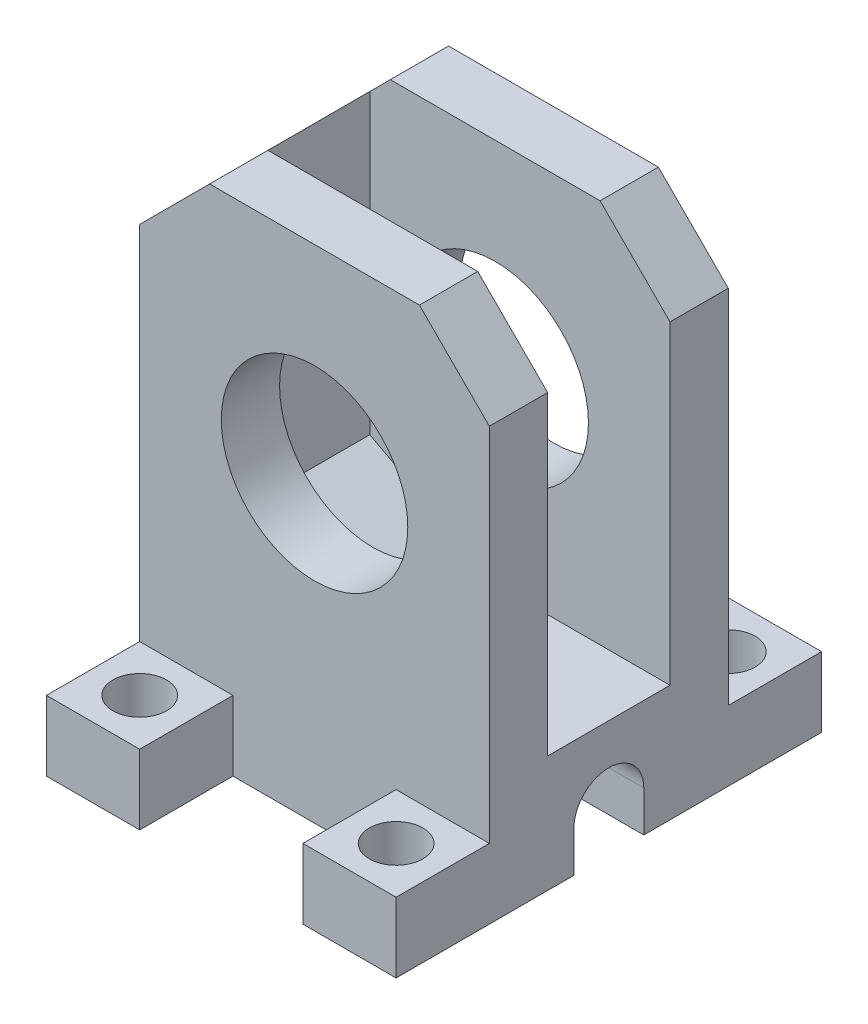
ISO-10303-21;
HEADER;
FILE_DESCRIPTION(('STEP AP214'),'2;1');
FILE_NAME('part.step','',(''),(''),'','','');
FILE_SCHEMA(('AUTOMOTIVE_DESIGN { 1 0 10303 214 1 1 1 1 }'));
ENDSEC;
DATA;
#1=APPLICATION_CONTEXT('core data for automotive mechanical design processes');
#2=APPLICATION_PROTOCOL_DEFINITION('international standard','automotive_design',2000,#1);
#3=PRODUCT_CONTEXT('',#1,'mechanical');
#4=PRODUCT('Part','Part','',(#3));
#5=PRODUCT_RELATED_PRODUCT_CATEGORY('part','',(#4));
#6=PRODUCT_DEFINITION_FORMATION('','',#4);
#7=PRODUCT_DEFINITION_CONTEXT('part definition',#1,'design');
#8=PRODUCT_DEFINITION('design','',#6,#7);
#9=PRODUCT_DEFINITION_SHAPE('','',#8);
#10=(LENGTH_UNIT() NAMED_UNIT(*) SI_UNIT(.MILLI.,.METRE.));
#11=(NAMED_UNIT(*) PLANE_ANGLE_UNIT() SI_UNIT($,.RADIAN.));
#12=(NAMED_UNIT(*) SI_UNIT($,.STERADIAN.) SOLID_ANGLE_UNIT());
#13=UNCERTAINTY_MEASURE_WITH_UNIT(LENGTH_MEASURE(1.E-05),#10,'distance_accuracy_value','');
#14=(GEOMETRIC_REPRESENTATION_CONTEXT(3) GLOBAL_UNCERTAINTY_ASSIGNED_CONTEXT((#13)) GLOBAL_UNIT_ASSIGNED_CONTEXT((#10,
#11,#12)) REPRESENTATION_CONTEXT('',''));
#15=CARTESIAN_POINT('',(0.,0.,0.));
#16=DIRECTION('',(0.,0.,1.));
#17=DIRECTION('',(1.,0.,0.));
#18=AXIS2_PLACEMENT_3D('',#15,#16,#17);
#19=CARTESIAN_POINT('',(0.,0.,-5.));
#20=DIRECTION('',(0.,0.,-1.));
#21=DIRECTION('',(-1.,0.,0.));
#22=AXIS2_PLACEMENT_3D('',#19,#20,#21);
#23=PLANE('',#22);
#24=CARTESIAN_POINT('',(0.,28.,-5.));
#25=DIRECTION('',(0.,0.,1.));
#26=DIRECTION('',(1.,0.,0.));
#27=AXIS2_PLACEMENT_3D('',#24,#25,#26);
#28=CIRCLE('',#27,8.);
#29=CARTESIAN_POINT('',(8.,28.,-5.));
#30=VERTEX_POINT('',#29);
#31=EDGE_CURVE('E258',#30,#30,#28,.T.);
#32=ORIENTED_EDGE('',*,*,#31,.T.);
#33=EDGE_LOOP('',(#32));
#34=FACE_BOUND('',#33,.T.);
#35=DIRECTION('',(0.882352941176471,-0.470588235294118,0.));
#36=VECTOR('',#35,1.);
#37=CARTESIAN_POINT('',(-15.,20.,-5.));
#38=LINE('',#37,#36);
#39=CARTESIAN_POINT('',(-10.7573593128807,17.737258300203,-5.));
#40=VERTEX_POINT('',#39);
#41=CARTESIAN_POINT('',(0.,12.,-5.));
#42=VERTEX_POINT('',#41);
#43=EDGE_CURVE('E849',#40,#42,#38,.T.);
#44=ORIENTED_EDGE('',*,*,#43,.F.);
#45=DIRECTION('',(0.,1.,0.));
#46=VECTOR('',#45,1.);
#47=CARTESIAN_POINT('',(-10.7573593128807,0.,-5.));
#48=LINE('',#47,#46);
#49=CARTESIAN_POINT('',(-10.7573593128807,43.2426406871193,-5.));
#50=VERTEX_POINT('',#49);
#51=EDGE_CURVE('E60',#40,#50,#48,.T.);
#52=ORIENTED_EDGE('',*,*,#51,.T.);
#53=DIRECTION('',(0.707106781186548,0.707106781186547,0.));
#54=VECTOR('',#53,1.);
#55=CARTESIAN_POINT('',(-27.,27.,-5.));
#56=LINE('',#55,#54);
#57=CARTESIAN_POINT('',(-9.,45.,-5.));
#58=VERTEX_POINT('',#57);
#59=EDGE_CURVE('E332',#50,#58,#56,.T.);
#60=ORIENTED_EDGE('',*,*,#59,.T.);
#61=DIRECTION('',(-1.,0.,0.));
#62=VECTOR('',#61,1.);
#63=CARTESIAN_POINT('',(-15.,45.,-5.));
#64=LINE('',#63,#62);
#65=CARTESIAN_POINT('',(8.99999999999999,45.,-5.));
#66=VERTEX_POINT('',#65);
#67=EDGE_CURVE('E247',#66,#58,#64,.T.);
#68=ORIENTED_EDGE('',*,*,#67,.F.);
#69=DIRECTION('',(0.707106781186548,-0.707106781186547,0.));
#70=VECTOR('',#69,1.);
#71=CARTESIAN_POINT('',(27.,27.,-5.));
#72=LINE('',#71,#70);
#73=CARTESIAN_POINT('',(15.,39.,-5.));
#74=VERTEX_POINT('',#73);
#75=EDGE_CURVE('E322',#66,#74,#72,.T.);
#76=ORIENTED_EDGE('',*,*,#75,.T.);
#77=DIRECTION('',(0.,1.,0.));
#78=VECTOR('',#77,1.);
#79=CARTESIAN_POINT('',(15.,45.,-5.));
#80=LINE('',#79,#78);
#81=CARTESIAN_POINT('',(15.,12.,-5.));
#82=VERTEX_POINT('',#81);
#83=EDGE_CURVE('E256',#82,#74,#80,.T.);
#84=ORIENTED_EDGE('',*,*,#83,.F.);
#85=DIRECTION('',(1.,0.,0.));
#86=VECTOR('',#85,1.);
#87=CARTESIAN_POINT('',(-15.,12.,-5.));
#88=LINE('',#87,#86);
#89=EDGE_CURVE('E299',#42,#82,#88,.T.);
#90=ORIENTED_EDGE('',*,*,#89,.F.);
#91=EDGE_LOOP('',(#44,#52,#60,#68,#76,#84,#90));
#92=FACE_BOUND('',#91,.T.);
#93=ADVANCED_FACE('F37',(#34,#92),#23,.T.);
#94=CARTESIAN_POINT('',(-15.,45.,-15.5));
#95=DIRECTION('',(0.,0.,1.));
#96=DIRECTION('',(1.,0.,0.));
#97=AXIS2_PLACEMENT_3D('',#94,#95,#96);
#98=PLANE('',#97);
#99=CARTESIAN_POINT('',(0.,28.,-15.5));
#100=DIRECTION('',(0.,0.,1.));
#101=DIRECTION('',(1.,0.,0.));
#102=AXIS2_PLACEMENT_3D('',#99,#100,#101);
#103=CIRCLE('',#102,8.);
#104=CARTESIAN_POINT('',(8.,28.,-15.5));
#105=VERTEX_POINT('',#104);
#106=EDGE_CURVE('E292',#105,#105,#103,.T.);
#107=ORIENTED_EDGE('',*,*,#106,.F.);
#108=EDGE_LOOP('',(#107));
#109=FACE_BOUND('',#108,.T.);
#110=DIRECTION('',(-0.707106781186548,-0.707106781186547,0.));
#111=VECTOR('',#110,1.);
#112=CARTESIAN_POINT('',(-12.,42.,-15.5));
#113=LINE('',#112,#111);
#114=CARTESIAN_POINT('',(-9.00000000000001,45.,-15.5));
#115=VERTEX_POINT('',#114);
#116=CARTESIAN_POINT('',(-10.7573593128807,43.2426406871193,-15.5));
#117=VERTEX_POINT('',#116);
#118=EDGE_CURVE('E52',#115,#117,#113,.T.);
#119=ORIENTED_EDGE('',*,*,#118,.T.);
#120=DIRECTION('',(0.,1.,0.));
#121=VECTOR('',#120,1.);
#122=CARTESIAN_POINT('',(-10.7573593128807,43.2426406871193,-15.5));
#123=LINE('',#122,#121);
#124=CARTESIAN_POINT('',(-10.7573593128807,17.737258300203,-15.5));
#125=VERTEX_POINT('',#124);
#126=EDGE_CURVE('E853',#125,#117,#123,.T.);
#127=ORIENTED_EDGE('',*,*,#126,.F.);
#128=DIRECTION('',(0.882352941176471,-0.470588235294118,0.));
#129=VECTOR('',#128,1.);
#130=CARTESIAN_POINT('',(-15.,20.,-15.5));
#131=LINE('',#130,#129);
#132=CARTESIAN_POINT('',(0.,12.,-15.5));
#133=VERTEX_POINT('',#132);
#134=EDGE_CURVE('E851',#125,#133,#131,.T.);
#135=ORIENTED_EDGE('',*,*,#134,.T.);
#136=DIRECTION('',(1.,0.,0.));
#137=VECTOR('',#136,1.);
#138=CARTESIAN_POINT('',(-15.,12.,-15.5));
#139=LINE('',#138,#137);
#140=CARTESIAN_POINT('',(15.,12.,-15.5));
#141=VERTEX_POINT('',#140);
#142=EDGE_CURVE('E301',#133,#141,#139,.T.);
#143=ORIENTED_EDGE('',*,*,#142,.T.);
#144=DIRECTION('',(0.,-1.,0.));
#145=VECTOR('',#144,1.);
#146=CARTESIAN_POINT('',(15.,45.,-15.5));
#147=LINE('',#146,#145);
#148=CARTESIAN_POINT('',(15.,39.,-15.5));
#149=VERTEX_POINT('',#148);
#150=EDGE_CURVE('E296',#149,#141,#147,.T.);
#151=ORIENTED_EDGE('',*,*,#150,.F.);
#152=DIRECTION('',(-0.707106781186548,0.707106781186547,0.));
#153=VECTOR('',#152,1.);
#154=CARTESIAN_POINT('',(-3.00000000000001,57.,-15.5));
#155=LINE('',#154,#153);
#156=CARTESIAN_POINT('',(8.99999999999999,45.,-15.5));
#157=VERTEX_POINT('',#156);
#158=EDGE_CURVE('E287',#149,#157,#155,.T.);
#159=ORIENTED_EDGE('',*,*,#158,.T.);
#160=DIRECTION('',(-1.,0.,0.));
#161=VECTOR('',#160,1.);
#162=CARTESIAN_POINT('',(-15.,45.,-15.5));
#163=LINE('',#162,#161);
#164=EDGE_CURVE('E280',#157,#115,#163,.T.);
#165=ORIENTED_EDGE('',*,*,#164,.T.);
#166=EDGE_LOOP('',(#119,#127,#135,#143,#151,#159,#165));
#167=FACE_BOUND('',#166,.T.);
#168=ADVANCED_FACE('F285',(#109,#167),#98,.T.);
#169=CARTESIAN_POINT('',(-15.,20.,-15.5));
#170=DIRECTION('',(-0.470588235294118,-0.88235294117647,0.));
#171=DIRECTION('',(0.882352941176471,-0.470588235294118,0.));
#172=AXIS2_PLACEMENT_3D('',#169,#170,#171);
#173=PLANE('',#172);
#174=DIRECTION('',(0.,0.,-1.));
#175=VECTOR('',#174,1.);
#176=CARTESIAN_POINT('',(-10.7573593128807,17.737258300203,-15.5));
#177=LINE('',#176,#175);
#178=EDGE_CURVE('E11',#40,#125,#177,.T.);
#179=ORIENTED_EDGE('',*,*,#178,.F.);
#180=ORIENTED_EDGE('',*,*,#43,.T.);
#181=DIRECTION('',(0.,0.,1.));
#182=VECTOR('',#181,1.);
#183=CARTESIAN_POINT('',(0.,12.,-15.5));
#184=LINE('',#183,#182);
#185=EDGE_CURVE('E857',#133,#42,#184,.T.);
#186=ORIENTED_EDGE('',*,*,#185,.F.);
#187=ORIENTED_EDGE('',*,*,#134,.F.);
#188=EDGE_LOOP('',(#179,#180,#186,#187));
#189=FACE_BOUND('',#188,.T.);
#190=ADVANCED_FACE('F491',(#189),#173,.F.);
#191=CARTESIAN_POINT('',(-15.,12.,-15.5));
#192=DIRECTION('',(0.,-1.,0.));
#193=DIRECTION('',(1.,0.,0.));
#194=AXIS2_PLACEMENT_3D('',#191,#192,#193);
#195=PLANE('',#194);
#196=ORIENTED_EDGE('',*,*,#185,.T.);
#197=ORIENTED_EDGE('',*,*,#89,.T.);
#198=DIRECTION('',(0.,0.,1.));
#199=VECTOR('',#198,1.);
#200=CARTESIAN_POINT('',(15.,12.,-15.5));
#201=LINE('',#200,#199);
#202=EDGE_CURVE('E303',#141,#82,#201,.T.);
#203=ORIENTED_EDGE('',*,*,#202,.F.);
#204=ORIENTED_EDGE('',*,*,#142,.F.);
#205=EDGE_LOOP('',(#196,#197,#203,#204));
#206=FACE_BOUND('',#205,.T.);
#207=ADVANCED_FACE('F497',(#206),#195,.F.);
#208=CARTESIAN_POINT('',(-15.,0.,-5.));
#209=DIRECTION('',(-1.,0.,0.));
#210=DIRECTION('',(0.,0.,1.));
#211=AXIS2_PLACEMENT_3D('',#208,#209,#210);
#212=PLANE('',#211);
#213=DIRECTION('',(0.,0.,1.));
#214=VECTOR('',#213,1.);
#215=CARTESIAN_POINT('',(-15.,39.,-50.));
#216=LINE('',#215,#214);
#217=CARTESIAN_POINT('',(-15.,39.,-20.5));
#218=VERTEX_POINT('',#217);
#219=CARTESIAN_POINT('',(-15.,39.,0.));
#220=VERTEX_POINT('',#219);
#221=EDGE_CURVE('E235',#218,#220,#216,.T.);
#222=ORIENTED_EDGE('',*,*,#221,.F.);
#223=DIRECTION('',(0.,-1.,0.));
#224=VECTOR('',#223,1.);
#225=CARTESIAN_POINT('',(-15.,45.,-20.5));
#226=LINE('',#225,#224);
#227=CARTESIAN_POINT('',(-15.,8.00000000000001,-20.5));
#228=VERTEX_POINT('',#227);
#229=EDGE_CURVE('E288',#218,#228,#226,.T.);
#230=ORIENTED_EDGE('',*,*,#229,.T.);
#231=DIRECTION('',(0.,0.,-1.));
#232=VECTOR('',#231,1.);
#233=CARTESIAN_POINT('',(-15.,8.,-20.5));
#234=LINE('',#233,#232);
#235=CARTESIAN_POINT('',(-15.,8.,-28.5));
#236=VERTEX_POINT('',#235);
#237=EDGE_CURVE('E417',#228,#236,#234,.T.);
#238=ORIENTED_EDGE('',*,*,#237,.T.);
#239=DIRECTION('',(0.,-1.,0.));
#240=VECTOR('',#239,1.);
#241=CARTESIAN_POINT('',(-15.,8.,-28.5));
#242=LINE('',#241,#240);
#243=CARTESIAN_POINT('',(-15.,2.,-28.5));
#244=VERTEX_POINT('',#243);
#245=EDGE_CURVE('E426',#236,#244,#242,.T.);
#246=ORIENTED_EDGE('',*,*,#245,.T.);
#247=DIRECTION('',(0.,0.,-1.));
#248=VECTOR('',#247,1.);
#249=CARTESIAN_POINT('',(-15.,2.,8.));
#250=LINE('',#249,#248);
#251=CARTESIAN_POINT('',(-15.,2.,-13.25));
#252=VERTEX_POINT('',#251);
#253=EDGE_CURVE('E354',#252,#244,#250,.T.);
#254=ORIENTED_EDGE('',*,*,#253,.F.);
#255=DIRECTION('',(0.,-1.,0.));
#256=VECTOR('',#255,1.);
#257=CARTESIAN_POINT('',(-15.,0.,-13.25));
#258=LINE('',#257,#256);
#259=CARTESIAN_POINT('',(-15.,5.5,-13.25));
#260=VERTEX_POINT('',#259);
#261=EDGE_CURVE('E339',#260,#252,#258,.T.);
#262=ORIENTED_EDGE('',*,*,#261,.F.);
#263=CARTESIAN_POINT('',(-15.,5.5,-10.25));
#264=DIRECTION('',(-1.,0.,0.));
#265=DIRECTION('',(0.,0.,1.));
#266=AXIS2_PLACEMENT_3D('',#263,#264,#265);
#267=CIRCLE('',#266,3.);
#268=CARTESIAN_POINT('',(-15.,5.5,-7.25));
#269=VERTEX_POINT('',#268);
#270=EDGE_CURVE('E336',#269,#260,#267,.T.);
#271=ORIENTED_EDGE('',*,*,#270,.F.);
#272=DIRECTION('',(0.,1.,0.));
#273=VECTOR('',#272,1.);
#274=CARTESIAN_POINT('',(-15.,0.,-7.25));
#275=LINE('',#274,#273);
#276=CARTESIAN_POINT('',(-15.,2.,-7.25));
#277=VERTEX_POINT('',#276);
#278=EDGE_CURVE('E341',#277,#269,#275,.T.);
#279=ORIENTED_EDGE('',*,*,#278,.F.);
#280=CARTESIAN_POINT('',(-15.,2.,8.));
#281=VERTEX_POINT('',#280);
#282=EDGE_CURVE('E355',#281,#277,#250,.T.);
#283=ORIENTED_EDGE('',*,*,#282,.F.);
#284=DIRECTION('',(0.,-1.,0.));
#285=VECTOR('',#284,1.);
#286=CARTESIAN_POINT('',(-15.,8.,8.));
#287=LINE('',#286,#285);
#288=CARTESIAN_POINT('',(-15.,8.,8.));
#289=VERTEX_POINT('',#288);
#290=EDGE_CURVE('E474',#289,#281,#287,.T.);
#291=ORIENTED_EDGE('',*,*,#290,.F.);
#292=DIRECTION('',(0.,0.,-1.));
#293=VECTOR('',#292,1.);
#294=CARTESIAN_POINT('',(-15.,8.,0.));
#295=LINE('',#294,#293);
#296=CARTESIAN_POINT('',(-15.,8.,0.));
#297=VERTEX_POINT('',#296);
#298=EDGE_CURVE('E470',#289,#297,#295,.T.);
#299=ORIENTED_EDGE('',*,*,#298,.T.);
#300=DIRECTION('',(0.,-1.,0.));
#301=VECTOR('',#300,1.);
#302=CARTESIAN_POINT('',(-15.,0.,0.));
#303=LINE('',#302,#301);
#304=EDGE_CURVE('E253',#220,#297,#303,.T.);
#305=ORIENTED_EDGE('',*,*,#304,.F.);
#306=EDGE_LOOP('',(#222,#230,#238,#246,#254,#262,#271,#279,#283,#291,#299,#305));
#307=FACE_BOUND('',#306,.T.);
#308=ADVANCED_FACE('F511',(#307),#212,.T.);
#309=CARTESIAN_POINT('',(15.,45.,-5.));
#310=DIRECTION('',(1.,0.,0.));
#311=DIRECTION('',(0.,1.,0.));
#312=AXIS2_PLACEMENT_3D('',#309,#310,#311);
#313=PLANE('',#312);
#314=DIRECTION('',(0.,-1.,0.));
#315=VECTOR('',#314,1.);
#316=CARTESIAN_POINT('',(15.,45.,-20.5));
#317=LINE('',#316,#315);
#318=CARTESIAN_POINT('',(15.,39.,-20.5));
#319=VERTEX_POINT('',#318);
#320=CARTESIAN_POINT('',(15.,8.,-20.5));
#321=VERTEX_POINT('',#320);
#322=EDGE_CURVE('E290',#319,#321,#317,.T.);
#323=ORIENTED_EDGE('',*,*,#322,.F.);
#324=DIRECTION('',(0.,0.,1.));
#325=VECTOR('',#324,1.);
#326=CARTESIAN_POINT('',(15.,39.,-50.));
#327=LINE('',#326,#325);
#328=EDGE_CURVE('E863',#319,#149,#327,.T.);
#329=ORIENTED_EDGE('',*,*,#328,.T.);
#330=ORIENTED_EDGE('',*,*,#150,.T.);
#331=ORIENTED_EDGE('',*,*,#202,.T.);
#332=ORIENTED_EDGE('',*,*,#83,.T.);
#333=CARTESIAN_POINT('',(15.,39.,0.));
#334=VERTEX_POINT('',#333);
#335=EDGE_CURVE('E318',#74,#334,#327,.T.);
#336=ORIENTED_EDGE('',*,*,#335,.T.);
#337=DIRECTION('',(0.,1.,0.));
#338=VECTOR('',#337,1.);
#339=CARTESIAN_POINT('',(15.,45.,0.));
#340=LINE('',#339,#338);
#341=CARTESIAN_POINT('',(15.,8.00000000000001,0.));
#342=VERTEX_POINT('',#341);
#343=EDGE_CURVE('E254',#342,#334,#340,.T.);
#344=ORIENTED_EDGE('',*,*,#343,.F.);
#345=DIRECTION('',(0.,0.,1.));
#346=VECTOR('',#345,1.);
#347=CARTESIAN_POINT('',(15.,8.,0.));
#348=LINE('',#347,#346);
#349=CARTESIAN_POINT('',(15.,8.,8.));
#350=VERTEX_POINT('',#349);
#351=EDGE_CURVE('E440',#342,#350,#348,.T.);
#352=ORIENTED_EDGE('',*,*,#351,.T.);
#353=DIRECTION('',(0.,-1.,0.));
#354=VECTOR('',#353,1.);
#355=CARTESIAN_POINT('',(15.,8.,8.));
#356=LINE('',#355,#354);
#357=CARTESIAN_POINT('',(15.,2.,8.));
#358=VERTEX_POINT('',#357);
#359=EDGE_CURVE('E449',#350,#358,#356,.T.);
#360=ORIENTED_EDGE('',*,*,#359,.T.);
#361=DIRECTION('',(0.,0.,1.));
#362=VECTOR('',#361,1.);
#363=CARTESIAN_POINT('',(15.,2.,-28.5));
#364=LINE('',#363,#362);
#365=CARTESIAN_POINT('',(15.,2.,-7.25));
#366=VERTEX_POINT('',#365);
#367=EDGE_CURVE('E368',#366,#358,#364,.T.);
#368=ORIENTED_EDGE('',*,*,#367,.F.);
#369=DIRECTION('',(0.,-1.,0.));
#370=VECTOR('',#369,1.);
#371=CARTESIAN_POINT('',(15.,45.,-7.24999999999999));
#372=LINE('',#371,#370);
#373=CARTESIAN_POINT('',(15.,5.5,-7.25));
#374=VERTEX_POINT('',#373);
#375=EDGE_CURVE('E350',#374,#366,#372,.T.);
#376=ORIENTED_EDGE('',*,*,#375,.F.);
#377=CARTESIAN_POINT('',(15.,5.5,-10.25));
#378=DIRECTION('',(1.,0.,0.));
#379=DIRECTION('',(0.,1.,0.));
#380=AXIS2_PLACEMENT_3D('',#377,#378,#379);
#381=CIRCLE('',#380,3.);
#382=CARTESIAN_POINT('',(15.,5.5,-13.25));
#383=VERTEX_POINT('',#382);
#384=EDGE_CURVE('E271',#383,#374,#381,.T.);
#385=ORIENTED_EDGE('',*,*,#384,.F.);
#386=DIRECTION('',(0.,1.,0.));
#387=VECTOR('',#386,1.);
#388=CARTESIAN_POINT('',(15.,45.,-13.25));
#389=LINE('',#388,#387);
#390=CARTESIAN_POINT('',(15.,2.,-13.25));
#391=VERTEX_POINT('',#390);
#392=EDGE_CURVE('E347',#391,#383,#389,.T.);
#393=ORIENTED_EDGE('',*,*,#392,.F.);
#394=CARTESIAN_POINT('',(15.,2.,-28.5));
#395=VERTEX_POINT('',#394);
#396=EDGE_CURVE('E369',#395,#391,#364,.T.);
#397=ORIENTED_EDGE('',*,*,#396,.F.);
#398=DIRECTION('',(0.,-1.,0.));
#399=VECTOR('',#398,1.);
#400=CARTESIAN_POINT('',(15.,8.,-28.5));
#401=LINE('',#400,#399);
#402=CARTESIAN_POINT('',(15.,8.,-28.5));
#403=VERTEX_POINT('',#402);
#404=EDGE_CURVE('E403',#403,#395,#401,.T.);
#405=ORIENTED_EDGE('',*,*,#404,.F.);
#406=DIRECTION('',(0.,0.,1.));
#407=VECTOR('',#406,1.);
#408=CARTESIAN_POINT('',(15.,8.,-20.5));
#409=LINE('',#408,#407);
#410=EDGE_CURVE('E399',#403,#321,#409,.T.);
#411=ORIENTED_EDGE('',*,*,#410,.T.);
#412=EDGE_LOOP('',(#323,#329,#330,#331,#332,#336,#344,#352,#360,#368,#376,#385,#393,#397,#405,#411));
#413=FACE_BOUND('',#412,.T.);
#414=ADVANCED_FACE('F39',(#413),#313,.T.);
#415=CARTESIAN_POINT('',(0.,0.,0.));
#416=DIRECTION('',(0.,0.,-1.));
#417=DIRECTION('',(-1.,0.,0.));
#418=AXIS2_PLACEMENT_3D('',#415,#416,#417);
#419=PLANE('',#418);
#420=CARTESIAN_POINT('',(0.,28.,0.));
#421=DIRECTION('',(0.,0.,1.));
#422=DIRECTION('',(1.,0.,0.));
#423=AXIS2_PLACEMENT_3D('',#420,#421,#422);
#424=CIRCLE('',#423,8.);
#425=CARTESIAN_POINT('',(8.,28.,0.));
#426=VERTEX_POINT('',#425);
#427=EDGE_CURVE('E307',#426,#426,#424,.T.);
#428=ORIENTED_EDGE('',*,*,#427,.F.);
#429=EDGE_LOOP('',(#428));
#430=FACE_BOUND('',#429,.T.);
#431=DIRECTION('',(-0.707106781186548,-0.707106781186547,0.));
#432=VECTOR('',#431,1.);
#433=CARTESIAN_POINT('',(-27.,27.,0.));
#434=LINE('',#433,#432);
#435=CARTESIAN_POINT('',(-9.,45.,0.));
#436=VERTEX_POINT('',#435);
#437=EDGE_CURVE('E229',#436,#220,#434,.T.);
#438=ORIENTED_EDGE('',*,*,#437,.T.);
#439=ORIENTED_EDGE('',*,*,#304,.T.);
#440=DIRECTION('',(1.,0.,0.));
#441=VECTOR('',#440,1.);
#442=CARTESIAN_POINT('',(-15.,8.,0.));
#443=LINE('',#442,#441);
#444=CARTESIAN_POINT('',(-7.,8.,0.));
#445=VERTEX_POINT('',#444);
#446=EDGE_CURVE('E461',#297,#445,#443,.T.);
#447=ORIENTED_EDGE('',*,*,#446,.T.);
#448=DIRECTION('',(0.,-1.,0.));
#449=VECTOR('',#448,1.);
#450=CARTESIAN_POINT('',(-7.,8.,0.));
#451=LINE('',#450,#449);
#452=CARTESIAN_POINT('',(-7.,2.,0.));
#453=VERTEX_POINT('',#452);
#454=EDGE_CURVE('E473',#445,#453,#451,.T.);
#455=ORIENTED_EDGE('',*,*,#454,.T.);
#456=DIRECTION('',(-1.,0.,0.));
#457=VECTOR('',#456,1.);
#458=CARTESIAN_POINT('',(7.,2.,0.));
#459=LINE('',#458,#457);
#460=CARTESIAN_POINT('',(7.,2.,0.));
#461=VERTEX_POINT('',#460);
#462=EDGE_CURVE('E376',#461,#453,#459,.T.);
#463=ORIENTED_EDGE('',*,*,#462,.F.);
#464=DIRECTION('',(0.,-1.,0.));
#465=VECTOR('',#464,1.);
#466=CARTESIAN_POINT('',(7.,8.,0.));
#467=LINE('',#466,#465);
#468=CARTESIAN_POINT('',(7.,8.,0.));
#469=VERTEX_POINT('',#468);
#470=EDGE_CURVE('E450',#469,#461,#467,.T.);
#471=ORIENTED_EDGE('',*,*,#470,.F.);
#472=DIRECTION('',(1.,0.,0.));
#473=VECTOR('',#472,1.);
#474=CARTESIAN_POINT('',(7.,8.,0.));
#475=LINE('',#474,#473);
#476=EDGE_CURVE('E438',#469,#342,#475,.T.);
#477=ORIENTED_EDGE('',*,*,#476,.T.);
#478=ORIENTED_EDGE('',*,*,#343,.T.);
#479=DIRECTION('',(-0.707106781186548,0.707106781186547,0.));
#480=VECTOR('',#479,1.);
#481=CARTESIAN_POINT('',(27.,27.,0.));
#482=LINE('',#481,#480);
#483=CARTESIAN_POINT('',(8.99999999999999,45.,0.));
#484=VERTEX_POINT('',#483);
#485=EDGE_CURVE('E252',#334,#484,#482,.T.);
#486=ORIENTED_EDGE('',*,*,#485,.T.);
#487=DIRECTION('',(-1.,0.,0.));
#488=VECTOR('',#487,1.);
#489=CARTESIAN_POINT('',(-15.,45.,0.));
#490=LINE('',#489,#488);
#491=EDGE_CURVE('E245',#484,#436,#490,.T.);
#492=ORIENTED_EDGE('',*,*,#491,.T.);
#493=EDGE_LOOP('',(#438,#439,#447,#455,#463,#471,#477,#478,#486,#492));
#494=FACE_BOUND('',#493,.T.);
#495=ADVANCED_FACE('F250',(#430,#494),#419,.F.);
#496=CARTESIAN_POINT('',(15.,45.,-20.5));
#497=DIRECTION('',(0.,0.,-1.));
#498=DIRECTION('',(-1.,0.,0.));
#499=AXIS2_PLACEMENT_3D('',#496,#497,#498);
#500=PLANE('',#499);
#501=CARTESIAN_POINT('',(0.,28.,-20.5));
#502=DIRECTION('',(0.,0.,-1.));
#503=DIRECTION('',(-1.,0.,0.));
#504=AXIS2_PLACEMENT_3D('',#501,#502,#503);
#505=CIRCLE('',#504,8.);
#506=CARTESIAN_POINT('',(-8.,28.,-20.5));
#507=VERTEX_POINT('',#506);
#508=EDGE_CURVE('E477',#507,#507,#505,.T.);
#509=ORIENTED_EDGE('',*,*,#508,.F.);
#510=EDGE_LOOP('',(#509));
#511=FACE_BOUND('',#510,.T.);
#512=ORIENTED_EDGE('',*,*,#229,.F.);
#513=DIRECTION('',(0.707106781186548,0.707106781186547,0.));
#514=VECTOR('',#513,1.);
#515=CARTESIAN_POINT('',(3.,57.,-20.5));
#516=LINE('',#515,#514);
#517=CARTESIAN_POINT('',(-9.,45.,-20.5));
#518=VERTEX_POINT('',#517);
#519=EDGE_CURVE('E334',#218,#518,#516,.T.);
#520=ORIENTED_EDGE('',*,*,#519,.T.);
#521=DIRECTION('',(1.,0.,0.));
#522=VECTOR('',#521,1.);
#523=CARTESIAN_POINT('',(15.,45.,-20.5));
#524=LINE('',#523,#522);
#525=CARTESIAN_POINT('',(8.99999999999999,45.,-20.5));
#526=VERTEX_POINT('',#525);
#527=EDGE_CURVE('E282',#518,#526,#524,.T.);
#528=ORIENTED_EDGE('',*,*,#527,.T.);
#529=DIRECTION('',(0.707106781186548,-0.707106781186547,0.));
#530=VECTOR('',#529,1.);
#531=CARTESIAN_POINT('',(12.,42.,-20.5));
#532=LINE('',#531,#530);
#533=EDGE_CURVE('E324',#526,#319,#532,.T.);
#534=ORIENTED_EDGE('',*,*,#533,.T.);
#535=ORIENTED_EDGE('',*,*,#322,.T.);
#536=DIRECTION('',(-1.,0.,0.));
#537=VECTOR('',#536,1.);
#538=CARTESIAN_POINT('',(7.,8.,-20.5));
#539=LINE('',#538,#537);
#540=CARTESIAN_POINT('',(7.,8.,-20.5));
#541=VERTEX_POINT('',#540);
#542=EDGE_CURVE('E390',#321,#541,#539,.T.);
#543=ORIENTED_EDGE('',*,*,#542,.T.);
#544=DIRECTION('',(0.,-1.,0.));
#545=VECTOR('',#544,1.);
#546=CARTESIAN_POINT('',(7.,8.,-20.5));
#547=LINE('',#546,#545);
#548=CARTESIAN_POINT('',(7.,2.,-20.5));
#549=VERTEX_POINT('',#548);
#550=EDGE_CURVE('E402',#541,#549,#547,.T.);
#551=ORIENTED_EDGE('',*,*,#550,.T.);
#552=DIRECTION('',(1.,0.,0.));
#553=VECTOR('',#552,1.);
#554=CARTESIAN_POINT('',(-7.,2.,-20.5));
#555=LINE('',#554,#553);
#556=CARTESIAN_POINT('',(-7.,2.,-20.5));
#557=VERTEX_POINT('',#556);
#558=EDGE_CURVE('E362',#557,#549,#555,.T.);
#559=ORIENTED_EDGE('',*,*,#558,.F.);
#560=DIRECTION('',(0.,-1.,0.));
#561=VECTOR('',#560,1.);
#562=CARTESIAN_POINT('',(-7.,8.,-20.5));
#563=LINE('',#562,#561);
#564=CARTESIAN_POINT('',(-7.,8.,-20.5));
#565=VERTEX_POINT('',#564);
#566=EDGE_CURVE('E427',#565,#557,#563,.T.);
#567=ORIENTED_EDGE('',*,*,#566,.F.);
#568=DIRECTION('',(-1.,0.,0.));
#569=VECTOR('',#568,1.);
#570=CARTESIAN_POINT('',(-7.,8.,-20.5));
#571=LINE('',#570,#569);
#572=EDGE_CURVE('E414',#565,#228,#571,.T.);
#573=ORIENTED_EDGE('',*,*,#572,.T.);
#574=EDGE_LOOP('',(#512,#520,#528,#534,#535,#543,#551,#559,#567,#573));
#575=FACE_BOUND('',#574,.T.);
#576=ADVANCED_FACE('F505',(#511,#575),#500,.T.);
#577=CARTESIAN_POINT('',(-15.,45.,-5.));
#578=DIRECTION('',(0.,1.,0.));
#579=DIRECTION('',(0.,0.,1.));
#580=AXIS2_PLACEMENT_3D('',#577,#578,#579);
#581=PLANE('',#580);
#582=ORIENTED_EDGE('',*,*,#67,.T.);
#583=DIRECTION('',(0.,0.,1.));
#584=VECTOR('',#583,1.);
#585=CARTESIAN_POINT('',(-9.,45.,-50.));
#586=LINE('',#585,#584);
#587=EDGE_CURVE('E232',#58,#436,#586,.T.);
#588=ORIENTED_EDGE('',*,*,#587,.T.);
#589=ORIENTED_EDGE('',*,*,#491,.F.);
#590=DIRECTION('',(0.,0.,1.));
#591=VECTOR('',#590,1.);
#592=CARTESIAN_POINT('',(8.99999999999999,45.,-50.));
#593=LINE('',#592,#591);
#594=EDGE_CURVE('E239',#66,#484,#593,.T.);
#595=ORIENTED_EDGE('',*,*,#594,.F.);
#596=EDGE_LOOP('',(#582,#588,#589,#595));
#597=FACE_BOUND('',#596,.T.);
#598=ADVANCED_FACE('F243',(#597),#581,.T.);
#599=CARTESIAN_POINT('',(0.,45.,0.));
#600=DIRECTION('',(0.,1.,0.));
#601=DIRECTION('',(0.,0.,1.));
#602=AXIS2_PLACEMENT_3D('',#599,#600,#601);
#603=PLANE('',#602);
#604=ORIENTED_EDGE('',*,*,#527,.F.);
#605=DIRECTION('',(0.,0.,1.));
#606=VECTOR('',#605,1.);
#607=CARTESIAN_POINT('',(-9.00000000000001,45.,0.));
#608=LINE('',#607,#606);
#609=EDGE_CURVE('E45',#518,#115,#608,.T.);
#610=ORIENTED_EDGE('',*,*,#609,.T.);
#611=ORIENTED_EDGE('',*,*,#164,.F.);
#612=DIRECTION('',(0.,0.,-1.));
#613=VECTOR('',#612,1.);
#614=CARTESIAN_POINT('',(8.99999999999999,45.,0.));
#615=LINE('',#614,#613);
#616=EDGE_CURVE('E273',#157,#526,#615,.T.);
#617=ORIENTED_EDGE('',*,*,#616,.T.);
#618=EDGE_LOOP('',(#604,#610,#611,#617));
#619=FACE_BOUND('',#618,.T.);
#620=ADVANCED_FACE('F279',(#619),#603,.T.);
#621=CARTESIAN_POINT('',(0.,2.,0.));
#622=DIRECTION('',(0.,-1.,0.));
#623=DIRECTION('',(0.,0.,-1.));
#624=AXIS2_PLACEMENT_3D('',#621,#622,#623);
#625=PLANE('',#624);
#626=DIRECTION('',(-1.,0.,0.));
#627=VECTOR('',#626,1.);
#628=CARTESIAN_POINT('',(0.,2.,-7.25));
#629=LINE('',#628,#627);
#630=EDGE_CURVE('E269',#366,#277,#629,.T.);
#631=ORIENTED_EDGE('',*,*,#630,.F.);
#632=ORIENTED_EDGE('',*,*,#367,.T.);
#633=DIRECTION('',(-1.,0.,0.));
#634=VECTOR('',#633,1.);
#635=CARTESIAN_POINT('',(15.,2.,8.));
#636=LINE('',#635,#634);
#637=CARTESIAN_POINT('',(7.,2.,8.));
#638=VERTEX_POINT('',#637);
#639=EDGE_CURVE('E372',#358,#638,#636,.T.);
#640=ORIENTED_EDGE('',*,*,#639,.T.);
#641=DIRECTION('',(0.,0.,-1.));
#642=VECTOR('',#641,1.);
#643=CARTESIAN_POINT('',(7.,2.,8.));
#644=LINE('',#643,#642);
#645=EDGE_CURVE('E374',#638,#461,#644,.T.);
#646=ORIENTED_EDGE('',*,*,#645,.T.);
#647=ORIENTED_EDGE('',*,*,#462,.T.);
#648=DIRECTION('',(0.,0.,1.));
#649=VECTOR('',#648,1.);
#650=CARTESIAN_POINT('',(-7.,2.,0.));
#651=LINE('',#650,#649);
#652=CARTESIAN_POINT('',(-7.,2.,8.));
#653=VERTEX_POINT('',#652);
#654=EDGE_CURVE('E266',#453,#653,#651,.T.);
#655=ORIENTED_EDGE('',*,*,#654,.T.);
#656=DIRECTION('',(-1.,0.,0.));
#657=VECTOR('',#656,1.);
#658=CARTESIAN_POINT('',(-7.,2.,8.));
#659=LINE('',#658,#657);
#660=EDGE_CURVE('E352',#653,#281,#659,.T.);
#661=ORIENTED_EDGE('',*,*,#660,.T.);
#662=ORIENTED_EDGE('',*,*,#282,.T.);
#663=EDGE_LOOP('',(#631,#632,#640,#646,#647,#655,#661,#662));
#664=FACE_BOUND('',#663,.T.);
#665=CARTESIAN_POINT('',(-11.,2.,4.));
#666=DIRECTION('',(0.,-1.,0.));
#667=DIRECTION('',(0.,0.,-1.));
#668=AXIS2_PLACEMENT_3D('',#665,#666,#667);
#669=CIRCLE('',#668,2.3);
#670=CARTESIAN_POINT('',(-11.,2.,1.7));
#671=VERTEX_POINT('',#670);
#672=EDGE_CURVE('E384',#671,#671,#669,.F.);
#673=ORIENTED_EDGE('',*,*,#672,.T.);
#674=EDGE_LOOP('',(#673));
#675=FACE_BOUND('',#674,.T.);
#676=CARTESIAN_POINT('',(11.,2.,4.));
#677=DIRECTION('',(0.,-1.,0.));
#678=DIRECTION('',(0.,0.,-1.));
#679=AXIS2_PLACEMENT_3D('',#676,#677,#678);
#680=CIRCLE('',#679,2.3);
#681=CARTESIAN_POINT('',(11.,2.,1.7));
#682=VERTEX_POINT('',#681);
#683=EDGE_CURVE('E381',#682,#682,#680,.F.);
#684=ORIENTED_EDGE('',*,*,#683,.T.);
#685=EDGE_LOOP('',(#684));
#686=FACE_BOUND('',#685,.T.);
#687=ADVANCED_FACE('F527',(#664,#675,#686),#625,.T.);
#688=CARTESIAN_POINT('',(-15.,8.,8.));
#689=DIRECTION('',(0.,0.,1.));
#690=DIRECTION('',(1.,0.,0.));
#691=AXIS2_PLACEMENT_3D('',#688,#689,#690);
#692=PLANE('',#691);
#693=ORIENTED_EDGE('',*,*,#290,.T.);
#694=ORIENTED_EDGE('',*,*,#660,.F.);
#695=DIRECTION('',(0.,-1.,0.));
#696=VECTOR('',#695,1.);
#697=CARTESIAN_POINT('',(-7.,8.,8.));
#698=LINE('',#697,#696);
#699=CARTESIAN_POINT('',(-7.,8.,8.));
#700=VERTEX_POINT('',#699);
#701=EDGE_CURVE('E478',#700,#653,#698,.T.);
#702=ORIENTED_EDGE('',*,*,#701,.F.);
#703=DIRECTION('',(-1.,0.,0.));
#704=VECTOR('',#703,1.);
#705=CARTESIAN_POINT('',(-15.,8.,8.));
#706=LINE('',#705,#704);
#707=EDGE_CURVE('E467',#700,#289,#706,.T.);
#708=ORIENTED_EDGE('',*,*,#707,.T.);
#709=EDGE_LOOP('',(#693,#694,#702,#708));
#710=FACE_BOUND('',#709,.T.);
#711=ADVANCED_FACE('F531',(#710),#692,.T.);
#712=CARTESIAN_POINT('',(-7.,8.,8.));
#713=DIRECTION('',(1.,0.,0.));
#714=DIRECTION('',(0.,0.,-1.));
#715=AXIS2_PLACEMENT_3D('',#712,#713,#714);
#716=PLANE('',#715);
#717=ORIENTED_EDGE('',*,*,#701,.T.);
#718=ORIENTED_EDGE('',*,*,#654,.F.);
#719=ORIENTED_EDGE('',*,*,#454,.F.);
#720=DIRECTION('',(0.,0.,1.));
#721=VECTOR('',#720,1.);
#722=CARTESIAN_POINT('',(-7.,8.,8.));
#723=LINE('',#722,#721);
#724=EDGE_CURVE('E464',#445,#700,#723,.T.);
#725=ORIENTED_EDGE('',*,*,#724,.T.);
#726=EDGE_LOOP('',(#717,#718,#719,#725));
#727=FACE_BOUND('',#726,.T.);
#728=ADVANCED_FACE('F538',(#727),#716,.T.);
#729=CARTESIAN_POINT('',(-11.,8.,4.));
#730=DIRECTION('',(0.,-1.,0.));
#731=DIRECTION('',(0.,0.,-1.));
#732=AXIS2_PLACEMENT_3D('',#729,#730,#731);
#733=CYLINDRICAL_SURFACE('',#732,2.3);
#734=CARTESIAN_POINT('',(-11.,8.,4.));
#735=DIRECTION('',(0.,-1.,0.));
#736=DIRECTION('',(0.,0.,-1.));
#737=AXIS2_PLACEMENT_3D('',#734,#735,#736);
#738=CIRCLE('',#737,2.3);
#739=CARTESIAN_POINT('',(-11.,8.,1.7));
#740=VERTEX_POINT('',#739);
#741=EDGE_CURVE('E453',#740,#740,#738,.T.);
#742=ORIENTED_EDGE('',*,*,#741,.F.);
#743=EDGE_LOOP('',(#742));
#744=FACE_BOUND('',#743,.T.);
#745=ORIENTED_EDGE('',*,*,#672,.F.);
#746=EDGE_LOOP('',(#745));
#747=FACE_BOUND('',#746,.T.);
#748=ADVANCED_FACE('F603',(#744,#747),#733,.F.);
#749=CARTESIAN_POINT('',(7.,8.,8.));
#750=DIRECTION('',(-1.,0.,0.));
#751=DIRECTION('',(0.,0.,1.));
#752=AXIS2_PLACEMENT_3D('',#749,#750,#751);
#753=PLANE('',#752);
#754=ORIENTED_EDGE('',*,*,#470,.T.);
#755=ORIENTED_EDGE('',*,*,#645,.F.);
#756=DIRECTION('',(0.,-1.,0.));
#757=VECTOR('',#756,1.);
#758=CARTESIAN_POINT('',(7.,8.,8.));
#759=LINE('',#758,#757);
#760=CARTESIAN_POINT('',(7.,8.,8.));
#761=VERTEX_POINT('',#760);
#762=EDGE_CURVE('E454',#761,#638,#759,.T.);
#763=ORIENTED_EDGE('',*,*,#762,.F.);
#764=DIRECTION('',(0.,0.,-1.));
#765=VECTOR('',#764,1.);
#766=CARTESIAN_POINT('',(7.,8.,8.));
#767=LINE('',#766,#765);
#768=EDGE_CURVE('E446',#761,#469,#767,.T.);
#769=ORIENTED_EDGE('',*,*,#768,.T.);
#770=EDGE_LOOP('',(#754,#755,#763,#769));
#771=FACE_BOUND('',#770,.T.);
#772=ADVANCED_FACE('F600',(#771),#753,.T.);
#773=CARTESIAN_POINT('',(15.,8.,8.));
#774=DIRECTION('',(0.,0.,1.));
#775=DIRECTION('',(1.,0.,0.));
#776=AXIS2_PLACEMENT_3D('',#773,#774,#775);
#777=PLANE('',#776);
#778=ORIENTED_EDGE('',*,*,#762,.T.);
#779=ORIENTED_EDGE('',*,*,#639,.F.);
#780=ORIENTED_EDGE('',*,*,#359,.F.);
#781=DIRECTION('',(-1.,0.,0.));
#782=VECTOR('',#781,1.);
#783=CARTESIAN_POINT('',(15.,8.,8.));
#784=LINE('',#783,#782);
#785=EDGE_CURVE('E443',#350,#761,#784,.T.);
#786=ORIENTED_EDGE('',*,*,#785,.T.);
#787=EDGE_LOOP('',(#778,#779,#780,#786));
#788=FACE_BOUND('',#787,.T.);
#789=ADVANCED_FACE('F594',(#788),#777,.T.);
#790=CARTESIAN_POINT('',(11.,8.,4.));
#791=DIRECTION('',(0.,-1.,0.));
#792=DIRECTION('',(0.,0.,-1.));
#793=AXIS2_PLACEMENT_3D('',#790,#791,#792);
#794=CYLINDRICAL_SURFACE('',#793,2.3);
#795=CARTESIAN_POINT('',(11.,8.,4.));
#796=DIRECTION('',(0.,-1.,0.));
#797=DIRECTION('',(0.,0.,-1.));
#798=AXIS2_PLACEMENT_3D('',#795,#796,#797);
#799=CIRCLE('',#798,2.3);
#800=CARTESIAN_POINT('',(11.,8.,1.7));
#801=VERTEX_POINT('',#800);
#802=EDGE_CURVE('E430',#801,#801,#799,.T.);
#803=ORIENTED_EDGE('',*,*,#802,.F.);
#804=EDGE_LOOP('',(#803));
#805=FACE_BOUND('',#804,.T.);
#806=ORIENTED_EDGE('',*,*,#683,.F.);
#807=EDGE_LOOP('',(#806));
#808=FACE_BOUND('',#807,.T.);
#809=ADVANCED_FACE('F589',(#805,#808),#794,.F.);
#810=CARTESIAN_POINT('',(-7.,8.,-28.5));
#811=DIRECTION('',(1.,0.,0.));
#812=DIRECTION('',(0.,0.,-1.));
#813=AXIS2_PLACEMENT_3D('',#810,#811,#812);
#814=PLANE('',#813);
#815=ORIENTED_EDGE('',*,*,#566,.T.);
#816=DIRECTION('',(0.,0.,1.));
#817=VECTOR('',#816,1.);
#818=CARTESIAN_POINT('',(-7.,2.,-28.5));
#819=LINE('',#818,#817);
#820=CARTESIAN_POINT('',(-7.,2.,-28.5));
#821=VERTEX_POINT('',#820);
#822=EDGE_CURVE('E360',#821,#557,#819,.T.);
#823=ORIENTED_EDGE('',*,*,#822,.F.);
#824=DIRECTION('',(0.,-1.,0.));
#825=VECTOR('',#824,1.);
#826=CARTESIAN_POINT('',(-7.,8.,-28.5));
#827=LINE('',#826,#825);
#828=CARTESIAN_POINT('',(-7.,8.,-28.5));
#829=VERTEX_POINT('',#828);
#830=EDGE_CURVE('E431',#829,#821,#827,.T.);
#831=ORIENTED_EDGE('',*,*,#830,.F.);
#832=DIRECTION('',(0.,0.,1.));
#833=VECTOR('',#832,1.);
#834=CARTESIAN_POINT('',(-7.,8.,-28.5));
#835=LINE('',#834,#833);
#836=EDGE_CURVE('E423',#829,#565,#835,.T.);
#837=ORIENTED_EDGE('',*,*,#836,.T.);
#838=EDGE_LOOP('',(#815,#823,#831,#837));
#839=FACE_BOUND('',#838,.T.);
#840=ADVANCED_FACE('F578',(#839),#814,.T.);
#841=CARTESIAN_POINT('',(-15.,8.,-28.5));
#842=DIRECTION('',(0.,0.,-1.));
#843=DIRECTION('',(-1.,0.,0.));
#844=AXIS2_PLACEMENT_3D('',#841,#842,#843);
#845=PLANE('',#844);
#846=ORIENTED_EDGE('',*,*,#830,.T.);
#847=DIRECTION('',(1.,0.,0.));
#848=VECTOR('',#847,1.);
#849=CARTESIAN_POINT('',(-15.,2.,-28.5));
#850=LINE('',#849,#848);
#851=EDGE_CURVE('E358',#244,#821,#850,.T.);
#852=ORIENTED_EDGE('',*,*,#851,.F.);
#853=ORIENTED_EDGE('',*,*,#245,.F.);
#854=DIRECTION('',(1.,0.,0.));
#855=VECTOR('',#854,1.);
#856=CARTESIAN_POINT('',(-15.,8.,-28.5));
#857=LINE('',#856,#855);
#858=EDGE_CURVE('E420',#236,#829,#857,.T.);
#859=ORIENTED_EDGE('',*,*,#858,.T.);
#860=EDGE_LOOP('',(#846,#852,#853,#859));
#861=FACE_BOUND('',#860,.T.);
#862=ADVANCED_FACE('F568',(#861),#845,.T.);
#863=CARTESIAN_POINT('',(-11.,8.,-24.5));
#864=DIRECTION('',(0.,-1.,0.));
#865=DIRECTION('',(0.,0.,-1.));
#866=AXIS2_PLACEMENT_3D('',#863,#864,#865);
#867=CYLINDRICAL_SURFACE('',#866,2.3);
#868=CARTESIAN_POINT('',(-11.,8.,-24.5));
#869=DIRECTION('',(0.,-1.,0.));
#870=DIRECTION('',(0.,0.,-1.));
#871=AXIS2_PLACEMENT_3D('',#868,#869,#870);
#872=CIRCLE('',#871,2.3);
#873=CARTESIAN_POINT('',(-11.,8.,-26.8));
#874=VERTEX_POINT('',#873);
#875=EDGE_CURVE('E406',#874,#874,#872,.T.);
#876=ORIENTED_EDGE('',*,*,#875,.F.);
#877=EDGE_LOOP('',(#876));
#878=FACE_BOUND('',#877,.T.);
#879=CARTESIAN_POINT('',(-11.,2.,-24.5));
#880=DIRECTION('',(0.,-1.,0.));
#881=DIRECTION('',(0.,0.,-1.));
#882=AXIS2_PLACEMENT_3D('',#879,#880,#881);
#883=CIRCLE('',#882,2.3);
#884=CARTESIAN_POINT('',(-11.,2.,-26.8));
#885=VERTEX_POINT('',#884);
#886=EDGE_CURVE('E265',#885,#885,#883,.F.);
#887=ORIENTED_EDGE('',*,*,#886,.F.);
#888=EDGE_LOOP('',(#887));
#889=FACE_BOUND('',#888,.T.);
#890=ADVANCED_FACE('F565',(#878,#889),#867,.F.);
#891=CARTESIAN_POINT('',(15.,8.,-28.5));
#892=DIRECTION('',(0.,0.,-1.));
#893=DIRECTION('',(-1.,0.,0.));
#894=AXIS2_PLACEMENT_3D('',#891,#892,#893);
#895=PLANE('',#894);
#896=ORIENTED_EDGE('',*,*,#404,.T.);
#897=DIRECTION('',(1.,0.,0.));
#898=VECTOR('',#897,1.);
#899=CARTESIAN_POINT('',(7.00000000000001,2.,-28.5));
#900=LINE('',#899,#898);
#901=CARTESIAN_POINT('',(7.00000000000001,2.,-28.5));
#902=VERTEX_POINT('',#901);
#903=EDGE_CURVE('E366',#902,#395,#900,.T.);
#904=ORIENTED_EDGE('',*,*,#903,.F.);
#905=DIRECTION('',(0.,-1.,0.));
#906=VECTOR('',#905,1.);
#907=CARTESIAN_POINT('',(7.00000000000001,8.,-28.5));
#908=LINE('',#907,#906);
#909=CARTESIAN_POINT('',(7.00000000000001,8.,-28.5));
#910=VERTEX_POINT('',#909);
#911=EDGE_CURVE('E407',#910,#902,#908,.T.);
#912=ORIENTED_EDGE('',*,*,#911,.F.);
#913=DIRECTION('',(1.,0.,0.));
#914=VECTOR('',#913,1.);
#915=CARTESIAN_POINT('',(15.,8.,-28.5));
#916=LINE('',#915,#914);
#917=EDGE_CURVE('E396',#910,#403,#916,.T.);
#918=ORIENTED_EDGE('',*,*,#917,.T.);
#919=EDGE_LOOP('',(#896,#904,#912,#918));
#920=FACE_BOUND('',#919,.T.);
#921=ADVANCED_FACE('F567',(#920),#895,.T.);
#922=CARTESIAN_POINT('',(7.00000000000001,8.,-28.5));
#923=DIRECTION('',(-1.,0.,0.));
#924=DIRECTION('',(0.,0.,1.));
#925=AXIS2_PLACEMENT_3D('',#922,#923,#924);
#926=PLANE('',#925);
#927=ORIENTED_EDGE('',*,*,#911,.T.);
#928=DIRECTION('',(0.,0.,-1.));
#929=VECTOR('',#928,1.);
#930=CARTESIAN_POINT('',(7.,2.,-20.5));
#931=LINE('',#930,#929);
#932=EDGE_CURVE('E364',#549,#902,#931,.T.);
#933=ORIENTED_EDGE('',*,*,#932,.F.);
#934=ORIENTED_EDGE('',*,*,#550,.F.);
#935=DIRECTION('',(0.,0.,-1.));
#936=VECTOR('',#935,1.);
#937=CARTESIAN_POINT('',(7.00000000000001,8.,-28.5));
#938=LINE('',#937,#936);
#939=EDGE_CURVE('E393',#541,#910,#938,.T.);
#940=ORIENTED_EDGE('',*,*,#939,.T.);
#941=EDGE_LOOP('',(#927,#933,#934,#940));
#942=FACE_BOUND('',#941,.T.);
#943=ADVANCED_FACE('F575',(#942),#926,.T.);
#944=CARTESIAN_POINT('',(11.,8.,-24.5));
#945=DIRECTION('',(0.,-1.,0.));
#946=DIRECTION('',(0.,0.,-1.));
#947=AXIS2_PLACEMENT_3D('',#944,#945,#946);
#948=CYLINDRICAL_SURFACE('',#947,2.3);
#949=CARTESIAN_POINT('',(11.,8.,-24.5));
#950=DIRECTION('',(0.,-1.,0.));
#951=DIRECTION('',(0.,0.,-1.));
#952=AXIS2_PLACEMENT_3D('',#949,#950,#951);
#953=CIRCLE('',#952,2.3);
#954=CARTESIAN_POINT('',(11.,8.,-26.8));
#955=VERTEX_POINT('',#954);
#956=EDGE_CURVE('E387',#955,#955,#953,.T.);
#957=ORIENTED_EDGE('',*,*,#956,.F.);
#958=EDGE_LOOP('',(#957));
#959=FACE_BOUND('',#958,.T.);
#960=CARTESIAN_POINT('',(11.,2.,-24.5));
#961=DIRECTION('',(0.,-1.,0.));
#962=DIRECTION('',(0.,0.,-1.));
#963=AXIS2_PLACEMENT_3D('',#960,#961,#962);
#964=CIRCLE('',#963,2.3);
#965=CARTESIAN_POINT('',(11.,2.,-26.8));
#966=VERTEX_POINT('',#965);
#967=EDGE_CURVE('E262',#966,#966,#964,.F.);
#968=ORIENTED_EDGE('',*,*,#967,.F.);
#969=EDGE_LOOP('',(#968));
#970=FACE_BOUND('',#969,.T.);
#971=ADVANCED_FACE('F515',(#959,#970),#948,.F.);
#972=CARTESIAN_POINT('',(0.,28.,-5.));
#973=DIRECTION('',(0.,0.,1.));
#974=DIRECTION('',(1.,0.,0.));
#975=AXIS2_PLACEMENT_3D('',#972,#973,#974);
#976=CYLINDRICAL_SURFACE('',#975,8.);
#977=ORIENTED_EDGE('',*,*,#31,.F.);
#978=EDGE_LOOP('',(#977));
#979=FACE_BOUND('',#978,.T.);
#980=ORIENTED_EDGE('',*,*,#427,.T.);
#981=EDGE_LOOP('',(#980));
#982=FACE_BOUND('',#981,.T.);
#983=ADVANCED_FACE('F513',(#979,#982),#976,.F.);
#984=CARTESIAN_POINT('',(0.,28.,-10.5));
#985=DIRECTION('',(0.,0.,-1.));
#986=DIRECTION('',(-1.,0.,0.));
#987=AXIS2_PLACEMENT_3D('',#984,#985,#986);
#988=CYLINDRICAL_SURFACE('',#987,8.);
#989=ORIENTED_EDGE('',*,*,#106,.T.);
#990=EDGE_LOOP('',(#989));
#991=FACE_BOUND('',#990,.T.);
#992=ORIENTED_EDGE('',*,*,#508,.T.);
#993=EDGE_LOOP('',(#992));
#994=FACE_BOUND('',#993,.T.);
#995=ADVANCED_FACE('F487',(#991,#994),#988,.F.);
#996=CARTESIAN_POINT('',(0.,8.,0.));
#997=DIRECTION('',(0.,1.,0.));
#998=DIRECTION('',(0.,0.,1.));
#999=AXIS2_PLACEMENT_3D('',#996,#997,#998);
#1000=PLANE('',#999);
#1001=ORIENTED_EDGE('',*,*,#741,.T.);
#1002=EDGE_LOOP('',(#1001));
#1003=FACE_BOUND('',#1002,.T.);
#1004=ORIENTED_EDGE('',*,*,#446,.F.);
#1005=ORIENTED_EDGE('',*,*,#298,.F.);
#1006=ORIENTED_EDGE('',*,*,#707,.F.);
#1007=ORIENTED_EDGE('',*,*,#724,.F.);
#1008=EDGE_LOOP('',(#1004,#1005,#1006,#1007));
#1009=FACE_BOUND('',#1008,.T.);
#1010=ADVANCED_FACE('F598',(#1003,#1009),#1000,.T.);
#1011=CARTESIAN_POINT('',(0.,8.,0.));
#1012=DIRECTION('',(0.,-1.,0.));
#1013=DIRECTION('',(0.,0.,-1.));
#1014=AXIS2_PLACEMENT_3D('',#1011,#1012,#1013);
#1015=PLANE('',#1014);
#1016=ORIENTED_EDGE('',*,*,#802,.T.);
#1017=EDGE_LOOP('',(#1016));
#1018=FACE_BOUND('',#1017,.T.);
#1019=ORIENTED_EDGE('',*,*,#476,.F.);
#1020=ORIENTED_EDGE('',*,*,#768,.F.);
#1021=ORIENTED_EDGE('',*,*,#785,.F.);
#1022=ORIENTED_EDGE('',*,*,#351,.F.);
#1023=EDGE_LOOP('',(#1019,#1020,#1021,#1022));
#1024=FACE_BOUND('',#1023,.T.);
#1025=ADVANCED_FACE('F586',(#1018,#1024),#1015,.F.);
#1026=CARTESIAN_POINT('',(0.,8.,0.));
#1027=DIRECTION('',(0.,-1.,0.));
#1028=DIRECTION('',(0.,0.,-1.));
#1029=AXIS2_PLACEMENT_3D('',#1026,#1027,#1028);
#1030=PLANE('',#1029);
#1031=ORIENTED_EDGE('',*,*,#875,.T.);
#1032=EDGE_LOOP('',(#1031));
#1033=FACE_BOUND('',#1032,.T.);
#1034=ORIENTED_EDGE('',*,*,#572,.F.);
#1035=ORIENTED_EDGE('',*,*,#836,.F.);
#1036=ORIENTED_EDGE('',*,*,#858,.F.);
#1037=ORIENTED_EDGE('',*,*,#237,.F.);
#1038=EDGE_LOOP('',(#1034,#1035,#1036,#1037));
#1039=FACE_BOUND('',#1038,.T.);
#1040=ADVANCED_FACE('F555',(#1033,#1039),#1030,.F.);
#1041=CARTESIAN_POINT('',(0.,8.,0.));
#1042=DIRECTION('',(0.,1.,0.));
#1043=DIRECTION('',(0.,0.,1.));
#1044=AXIS2_PLACEMENT_3D('',#1041,#1042,#1043);
#1045=PLANE('',#1044);
#1046=ORIENTED_EDGE('',*,*,#956,.T.);
#1047=EDGE_LOOP('',(#1046));
#1048=FACE_BOUND('',#1047,.T.);
#1049=ORIENTED_EDGE('',*,*,#542,.F.);
#1050=ORIENTED_EDGE('',*,*,#410,.F.);
#1051=ORIENTED_EDGE('',*,*,#917,.F.);
#1052=ORIENTED_EDGE('',*,*,#939,.F.);
#1053=EDGE_LOOP('',(#1049,#1050,#1051,#1052));
#1054=FACE_BOUND('',#1053,.T.);
#1055=ADVANCED_FACE('F547',(#1048,#1054),#1045,.T.);
#1056=DIRECTION('',(1.,0.,0.));
#1057=VECTOR('',#1056,1.);
#1058=CARTESIAN_POINT('',(0.,2.,-13.25));
#1059=LINE('',#1058,#1057);
#1060=EDGE_CURVE('E267',#252,#391,#1059,.T.);
#1061=ORIENTED_EDGE('',*,*,#1060,.F.);
#1062=ORIENTED_EDGE('',*,*,#253,.T.);
#1063=ORIENTED_EDGE('',*,*,#851,.T.);
#1064=ORIENTED_EDGE('',*,*,#822,.T.);
#1065=ORIENTED_EDGE('',*,*,#558,.T.);
#1066=ORIENTED_EDGE('',*,*,#932,.T.);
#1067=ORIENTED_EDGE('',*,*,#903,.T.);
#1068=ORIENTED_EDGE('',*,*,#396,.T.);
#1069=EDGE_LOOP('',(#1061,#1062,#1063,#1064,#1065,#1066,#1067,#1068));
#1070=FACE_BOUND('',#1069,.T.);
#1071=ORIENTED_EDGE('',*,*,#967,.T.);
#1072=EDGE_LOOP('',(#1071));
#1073=FACE_BOUND('',#1072,.T.);
#1074=ORIENTED_EDGE('',*,*,#886,.T.);
#1075=EDGE_LOOP('',(#1074));
#1076=FACE_BOUND('',#1075,.T.);
#1077=ADVANCED_FACE('F534',(#1070,#1073,#1076),#625,.T.);
#1078=CARTESIAN_POINT('',(35.,5.5,-10.25));
#1079=DIRECTION('',(-1.,0.,0.));
#1080=DIRECTION('',(0.,0.,1.));
#1081=AXIS2_PLACEMENT_3D('',#1078,#1079,#1080);
#1082=CYLINDRICAL_SURFACE('',#1081,3.);
#1083=ORIENTED_EDGE('',*,*,#384,.T.);
#1084=DIRECTION('',(-1.,0.,0.));
#1085=VECTOR('',#1084,1.);
#1086=CARTESIAN_POINT('',(35.,5.5,-7.25));
#1087=LINE('',#1086,#1085);
#1088=EDGE_CURVE('E345',#374,#269,#1087,.T.);
#1089=ORIENTED_EDGE('',*,*,#1088,.T.);
#1090=ORIENTED_EDGE('',*,*,#270,.T.);
#1091=DIRECTION('',(-1.,0.,0.));
#1092=VECTOR('',#1091,1.);
#1093=CARTESIAN_POINT('',(35.,5.5,-13.25));
#1094=LINE('',#1093,#1092);
#1095=EDGE_CURVE('E344',#383,#260,#1094,.T.);
#1096=ORIENTED_EDGE('',*,*,#1095,.F.);
#1097=EDGE_LOOP('',(#1083,#1089,#1090,#1096));
#1098=FACE_BOUND('',#1097,.T.);
#1099=ADVANCED_FACE('F546',(#1098),#1082,.F.);
#1100=CARTESIAN_POINT('',(35.,0.,-7.25));
#1101=DIRECTION('',(0.,0.,1.));
#1102=DIRECTION('',(0.,-1.,0.));
#1103=AXIS2_PLACEMENT_3D('',#1100,#1101,#1102);
#1104=PLANE('',#1103);
#1105=ORIENTED_EDGE('',*,*,#375,.T.);
#1106=ORIENTED_EDGE('',*,*,#630,.T.);
#1107=ORIENTED_EDGE('',*,*,#278,.T.);
#1108=ORIENTED_EDGE('',*,*,#1088,.F.);
#1109=EDGE_LOOP('',(#1105,#1106,#1107,#1108));
#1110=FACE_BOUND('',#1109,.T.);
#1111=ADVANCED_FACE('F553',(#1110),#1104,.F.);
#1112=CARTESIAN_POINT('',(35.,0.,-13.25));
#1113=DIRECTION('',(0.,0.,-1.));
#1114=DIRECTION('',(-1.,0.,0.));
#1115=AXIS2_PLACEMENT_3D('',#1112,#1113,#1114);
#1116=PLANE('',#1115);
#1117=ORIENTED_EDGE('',*,*,#392,.T.);
#1118=ORIENTED_EDGE('',*,*,#1095,.T.);
#1119=ORIENTED_EDGE('',*,*,#261,.T.);
#1120=ORIENTED_EDGE('',*,*,#1060,.T.);
#1121=EDGE_LOOP('',(#1117,#1118,#1119,#1120));
#1122=FACE_BOUND('',#1121,.T.);
#1123=ADVANCED_FACE('F734',(#1122),#1116,.F.);
#1124=CARTESIAN_POINT('',(27.,27.,-50.));
#1125=DIRECTION('',(0.707106781186547,0.707106781186548,0.));
#1126=DIRECTION('',(-0.707106781186548,0.707106781186547,0.));
#1127=AXIS2_PLACEMENT_3D('',#1124,#1125,#1126);
#1128=PLANE('',#1127);
#1129=ORIENTED_EDGE('',*,*,#616,.F.);
#1130=ORIENTED_EDGE('',*,*,#158,.F.);
#1131=ORIENTED_EDGE('',*,*,#328,.F.);
#1132=ORIENTED_EDGE('',*,*,#533,.F.);
#1133=EDGE_LOOP('',(#1129,#1130,#1131,#1132));
#1134=FACE_BOUND('',#1133,.T.);
#1135=ADVANCED_FACE('F744',(#1134),#1128,.T.);
#1136=ORIENTED_EDGE('',*,*,#594,.T.);
#1137=ORIENTED_EDGE('',*,*,#485,.F.);
#1138=ORIENTED_EDGE('',*,*,#335,.F.);
#1139=ORIENTED_EDGE('',*,*,#75,.F.);
#1140=EDGE_LOOP('',(#1136,#1137,#1138,#1139));
#1141=FACE_BOUND('',#1140,.T.);
#1142=ADVANCED_FACE('F784',(#1141),#1128,.T.);
#1143=CARTESIAN_POINT('',(-27.,27.,-50.));
#1144=DIRECTION('',(-0.707106781186547,0.707106781186548,0.));
#1145=DIRECTION('',(-0.707106781186548,-0.707106781186547,0.));
#1146=AXIS2_PLACEMENT_3D('',#1143,#1144,#1145);
#1147=PLANE('',#1146);
#1148=ORIENTED_EDGE('',*,*,#59,.F.);
#1149=DIRECTION('',(0.,0.,-1.));
#1150=VECTOR('',#1149,1.);
#1151=CARTESIAN_POINT('',(-10.7573593128807,43.2426406871193,-0.5));
#1152=LINE('',#1151,#1150);
#1153=EDGE_CURVE('E848',#50,#117,#1152,.T.);
#1154=ORIENTED_EDGE('',*,*,#1153,.T.);
#1155=ORIENTED_EDGE('',*,*,#118,.F.);
#1156=ORIENTED_EDGE('',*,*,#609,.F.);
#1157=ORIENTED_EDGE('',*,*,#519,.F.);
#1158=ORIENTED_EDGE('',*,*,#221,.T.);
#1159=ORIENTED_EDGE('',*,*,#437,.F.);
#1160=ORIENTED_EDGE('',*,*,#587,.F.);
#1161=EDGE_LOOP('',(#1148,#1154,#1155,#1156,#1157,#1158,#1159,#1160));
#1162=FACE_BOUND('',#1161,.T.);
#1163=ADVANCED_FACE('F231',(#1162),#1147,.T.);
#1164=CARTESIAN_POINT('',(-10.7573593128807,43.2426406871193,-0.5));
#1165=DIRECTION('',(-1.,0.,0.));
#1166=DIRECTION('',(0.,-1.,0.));
#1167=AXIS2_PLACEMENT_3D('',#1164,#1165,#1166);
#1168=PLANE('',#1167);
#1169=ORIENTED_EDGE('',*,*,#51,.F.);
#1170=ORIENTED_EDGE('',*,*,#178,.T.);
#1171=ORIENTED_EDGE('',*,*,#126,.T.);
#1172=ORIENTED_EDGE('',*,*,#1153,.F.);
#1173=EDGE_LOOP('',(#1169,#1170,#1171,#1172));
#1174=FACE_BOUND('',#1173,.T.);
#1175=ADVANCED_FACE('F833',(#1174),#1168,.F.);
#1176=CLOSED_SHELL('',(#93,#168,#190,#207,#308,#414,#495,#576,#598,#620,#687,#711,#728,#748,
#772,#789,#809,#840,#862,#890,#921,#943,#971,#983,#995,#1010,#1025,#1040,#1055,#1077,#1099,
#1111,#1123,#1135,#1142,#1163,#1175));
#1177=MANIFOLD_SOLID_BREP('B2',#1176);
#1178=ADVANCED_BREP_SHAPE_REPRESENTATION('',(#18,#1177),#14);
#1179=SHAPE_DEFINITION_REPRESENTATION(#9,#1178);
ENDSEC;
END-ISO-10303-21;
